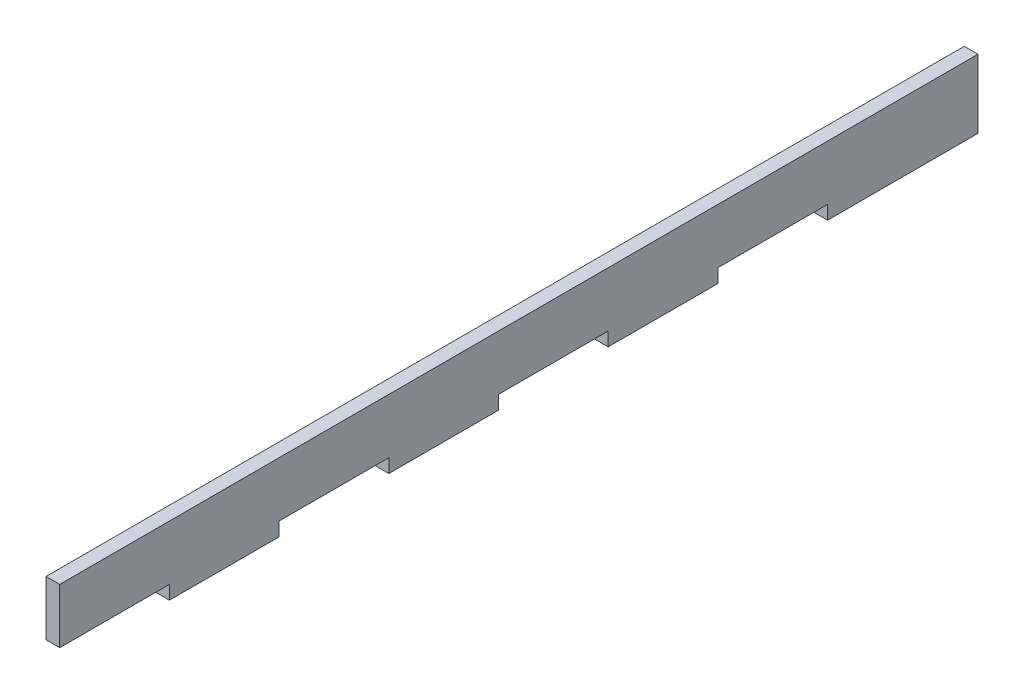
ISO-10303-21;
HEADER;
FILE_DESCRIPTION(('STEP AP214'),'2;1');
FILE_NAME('part.step','',(''),(''),'','','');
FILE_SCHEMA(('AUTOMOTIVE_DESIGN { 1 0 10303 214 1 1 1 1 }'));
ENDSEC;
DATA;
#1=APPLICATION_CONTEXT('core data for automotive mechanical design processes');
#2=APPLICATION_PROTOCOL_DEFINITION('international standard','automotive_design',2000,#1);
#3=PRODUCT_CONTEXT('',#1,'mechanical');
#4=PRODUCT('Part','Part','',(#3));
#5=PRODUCT_RELATED_PRODUCT_CATEGORY('part','',(#4));
#6=PRODUCT_DEFINITION_FORMATION('','',#4);
#7=PRODUCT_DEFINITION_CONTEXT('part definition',#1,'design');
#8=PRODUCT_DEFINITION('design','',#6,#7);
#9=PRODUCT_DEFINITION_SHAPE('','',#8);
#10=(LENGTH_UNIT() NAMED_UNIT(*) SI_UNIT(.MILLI.,.METRE.));
#11=(NAMED_UNIT(*) PLANE_ANGLE_UNIT() SI_UNIT($,.RADIAN.));
#12=(NAMED_UNIT(*) SI_UNIT($,.STERADIAN.) SOLID_ANGLE_UNIT());
#13=UNCERTAINTY_MEASURE_WITH_UNIT(LENGTH_MEASURE(1.E-05),#10,'distance_accuracy_value','');
#14=(GEOMETRIC_REPRESENTATION_CONTEXT(3) GLOBAL_UNCERTAINTY_ASSIGNED_CONTEXT((#13)) GLOBAL_UNIT_ASSIGNED_CONTEXT((#10,
#11,#12)) REPRESENTATION_CONTEXT('',''));
#15=CARTESIAN_POINT('',(0.,0.,0.));
#16=DIRECTION('',(0.,0.,1.));
#17=DIRECTION('',(1.,0.,0.));
#18=AXIS2_PLACEMENT_3D('',#15,#16,#17);
#19=CARTESIAN_POINT('',(6.35,0.,-422.789544579189));
#20=DIRECTION('',(0.,0.,1.));
#21=DIRECTION('',(1.,0.,0.));
#22=AXIS2_PLACEMENT_3D('',#19,#20,#21);
#23=PLANE('',#22);
#24=DIRECTION('',(0.,1.,0.));
#25=VECTOR('',#24,1.);
#26=CARTESIAN_POINT('',(0.,0.,-422.789544579189));
#27=LINE('',#26,#25);
#28=CARTESIAN_POINT('',(0.,0.,-422.789544579189));
#29=VERTEX_POINT('',#28);
#30=CARTESIAN_POINT('',(0.,31.7499999999996,-422.789544579189));
#31=VERTEX_POINT('',#30);
#32=EDGE_CURVE('E191',#29,#31,#27,.T.);
#33=ORIENTED_EDGE('',*,*,#32,.T.);
#34=DIRECTION('',(-1.,0.,0.));
#35=VECTOR('',#34,1.);
#36=CARTESIAN_POINT('',(6.35,31.7499999999996,-422.789544579189));
#37=LINE('',#36,#35);
#38=CARTESIAN_POINT('',(6.35,31.7499999999996,-422.789544579189));
#39=VERTEX_POINT('',#38);
#40=EDGE_CURVE('E11',#39,#31,#37,.T.);
#41=ORIENTED_EDGE('',*,*,#40,.F.);
#42=DIRECTION('',(0.,1.,0.));
#43=VECTOR('',#42,1.);
#44=CARTESIAN_POINT('',(6.35,0.,-422.789544579189));
#45=LINE('',#44,#43);
#46=CARTESIAN_POINT('',(6.35,0.,-422.789544579189));
#47=VERTEX_POINT('',#46);
#48=EDGE_CURVE('E225',#47,#39,#45,.T.);
#49=ORIENTED_EDGE('',*,*,#48,.F.);
#50=DIRECTION('',(-1.,0.,0.));
#51=VECTOR('',#50,1.);
#52=CARTESIAN_POINT('',(6.35,0.,-422.789544579189));
#53=LINE('',#52,#51);
#54=EDGE_CURVE('E187',#47,#29,#53,.T.);
#55=ORIENTED_EDGE('',*,*,#54,.T.);
#56=EDGE_LOOP('',(#33,#41,#49,#55));
#57=FACE_BOUND('',#56,.T.);
#58=ADVANCED_FACE('F35',(#57),#23,.F.);
#59=CARTESIAN_POINT('',(6.35,31.7499999999996,2.48059425587843));
#60=DIRECTION('',(0.,-1.,0.));
#61=DIRECTION('',(0.,0.,-1.));
#62=AXIS2_PLACEMENT_3D('',#59,#60,#61);
#63=PLANE('',#62);
#64=DIRECTION('',(0.,0.,1.));
#65=VECTOR('',#64,1.);
#66=CARTESIAN_POINT('',(0.,31.7499999999996,2.48059425587843));
#67=LINE('',#66,#65);
#68=CARTESIAN_POINT('',(0.,31.7499999999996,2.48059425587843));
#69=VERTEX_POINT('',#68);
#70=EDGE_CURVE('E194',#31,#69,#67,.T.);
#71=ORIENTED_EDGE('',*,*,#70,.T.);
#72=DIRECTION('',(-1.,0.,0.));
#73=VECTOR('',#72,1.);
#74=CARTESIAN_POINT('',(6.35,31.7499999999996,2.48059425587843));
#75=LINE('',#74,#73);
#76=CARTESIAN_POINT('',(6.35,31.7499999999996,2.48059425587843));
#77=VERTEX_POINT('',#76);
#78=EDGE_CURVE('E43',#77,#69,#75,.T.);
#79=ORIENTED_EDGE('',*,*,#78,.F.);
#80=DIRECTION('',(0.,0.,1.));
#81=VECTOR('',#80,1.);
#82=CARTESIAN_POINT('',(6.35,31.7499999999996,2.48059425587843));
#83=LINE('',#82,#81);
#84=EDGE_CURVE('E124',#39,#77,#83,.T.);
#85=ORIENTED_EDGE('',*,*,#84,.F.);
#86=ORIENTED_EDGE('',*,*,#40,.T.);
#87=EDGE_LOOP('',(#71,#79,#85,#86));
#88=FACE_BOUND('',#87,.T.);
#89=ADVANCED_FACE('F333',(#88),#63,.F.);
#90=CARTESIAN_POINT('',(6.35,6.34999999999997,2.48059425587843));
#91=DIRECTION('',(0.,0.,-1.));
#92=DIRECTION('',(-1.,0.,0.));
#93=AXIS2_PLACEMENT_3D('',#90,#91,#92);
#94=PLANE('',#93);
#95=DIRECTION('',(0.,-1.,0.));
#96=VECTOR('',#95,1.);
#97=CARTESIAN_POINT('',(0.,6.34999999999997,2.48059425587843));
#98=LINE('',#97,#96);
#99=CARTESIAN_POINT('',(0.,6.34999999999997,2.48059425587843));
#100=VERTEX_POINT('',#99);
#101=EDGE_CURVE('E196',#69,#100,#98,.T.);
#102=ORIENTED_EDGE('',*,*,#101,.T.);
#103=DIRECTION('',(-1.,0.,0.));
#104=VECTOR('',#103,1.);
#105=CARTESIAN_POINT('',(6.35,6.34999999999997,2.48059425587843));
#106=LINE('',#105,#104);
#107=CARTESIAN_POINT('',(6.35,6.34999999999997,2.48059425587843));
#108=VERTEX_POINT('',#107);
#109=EDGE_CURVE('E262',#108,#100,#106,.T.);
#110=ORIENTED_EDGE('',*,*,#109,.F.);
#111=DIRECTION('',(0.,-1.,0.));
#112=VECTOR('',#111,1.);
#113=CARTESIAN_POINT('',(6.35,6.34999999999997,2.48059425587843));
#114=LINE('',#113,#112);
#115=EDGE_CURVE('E270',#77,#108,#114,.T.);
#116=ORIENTED_EDGE('',*,*,#115,.F.);
#117=ORIENTED_EDGE('',*,*,#78,.T.);
#118=EDGE_LOOP('',(#102,#110,#116,#117));
#119=FACE_BOUND('',#118,.T.);
#120=ADVANCED_FACE('F268',(#119),#94,.F.);
#121=CARTESIAN_POINT('',(6.35,6.34999999999997,2.48059425587843));
#122=DIRECTION('',(0.,1.,0.));
#123=DIRECTION('',(0.,0.,1.));
#124=AXIS2_PLACEMENT_3D('',#121,#122,#123);
#125=PLANE('',#124);
#126=DIRECTION('',(0.,0.,-1.));
#127=VECTOR('',#126,1.);
#128=CARTESIAN_POINT('',(0.,6.34999999999997,2.48059425587843));
#129=LINE('',#128,#127);
#130=CARTESIAN_POINT('',(0.,6.34999999999999,-48.3194057441216));
#131=VERTEX_POINT('',#130);
#132=EDGE_CURVE('E198',#100,#131,#129,.T.);
#133=ORIENTED_EDGE('',*,*,#132,.T.);
#134=DIRECTION('',(-1.,0.,0.));
#135=VECTOR('',#134,1.);
#136=CARTESIAN_POINT('',(6.35,6.34999999999999,-48.3194057441216));
#137=LINE('',#136,#135);
#138=CARTESIAN_POINT('',(6.35,6.34999999999999,-48.3194057441216));
#139=VERTEX_POINT('',#138);
#140=EDGE_CURVE('E259',#139,#131,#137,.T.);
#141=ORIENTED_EDGE('',*,*,#140,.F.);
#142=DIRECTION('',(0.,0.,-1.));
#143=VECTOR('',#142,1.);
#144=CARTESIAN_POINT('',(6.35,6.34999999999997,2.48059425587843));
#145=LINE('',#144,#143);
#146=EDGE_CURVE('E288',#108,#139,#145,.T.);
#147=ORIENTED_EDGE('',*,*,#146,.F.);
#148=ORIENTED_EDGE('',*,*,#109,.T.);
#149=EDGE_LOOP('',(#133,#141,#147,#148));
#150=FACE_BOUND('',#149,.T.);
#151=ADVANCED_FACE('F279',(#150),#125,.F.);
#152=CARTESIAN_POINT('',(6.35,6.34999999999999,-48.3194057441216));
#153=DIRECTION('',(0.,0.,-1.));
#154=DIRECTION('',(-1.,0.,0.));
#155=AXIS2_PLACEMENT_3D('',#152,#153,#154);
#156=PLANE('',#155);
#157=DIRECTION('',(0.,-1.,0.));
#158=VECTOR('',#157,1.);
#159=CARTESIAN_POINT('',(0.,6.34999999999999,-48.3194057441216));
#160=LINE('',#159,#158);
#161=CARTESIAN_POINT('',(0.,0.,-48.3194057441216));
#162=VERTEX_POINT('',#161);
#163=EDGE_CURVE('E200',#131,#162,#160,.T.);
#164=ORIENTED_EDGE('',*,*,#163,.T.);
#165=DIRECTION('',(-1.,0.,0.));
#166=VECTOR('',#165,1.);
#167=CARTESIAN_POINT('',(6.35,0.,-48.3194057441216));
#168=LINE('',#167,#166);
#169=CARTESIAN_POINT('',(6.35,0.,-48.3194057441216));
#170=VERTEX_POINT('',#169);
#171=EDGE_CURVE('E256',#170,#162,#168,.T.);
#172=ORIENTED_EDGE('',*,*,#171,.F.);
#173=DIRECTION('',(0.,-1.,0.));
#174=VECTOR('',#173,1.);
#175=CARTESIAN_POINT('',(6.35,6.34999999999999,-48.3194057441216));
#176=LINE('',#175,#174);
#177=EDGE_CURVE('E285',#139,#170,#176,.T.);
#178=ORIENTED_EDGE('',*,*,#177,.F.);
#179=ORIENTED_EDGE('',*,*,#140,.T.);
#180=EDGE_LOOP('',(#164,#172,#178,#179));
#181=FACE_BOUND('',#180,.T.);
#182=ADVANCED_FACE('F283',(#181),#156,.F.);
#183=CARTESIAN_POINT('',(6.35,0.,-48.3194057441216));
#184=DIRECTION('',(0.,1.,0.));
#185=DIRECTION('',(0.,0.,1.));
#186=AXIS2_PLACEMENT_3D('',#183,#184,#185);
#187=PLANE('',#186);
#188=DIRECTION('',(0.,0.,-1.));
#189=VECTOR('',#188,1.);
#190=CARTESIAN_POINT('',(0.,0.,-48.3194057441216));
#191=LINE('',#190,#189);
#192=CARTESIAN_POINT('',(0.,0.,-99.1194057441216));
#193=VERTEX_POINT('',#192);
#194=EDGE_CURVE('E202',#162,#193,#191,.T.);
#195=ORIENTED_EDGE('',*,*,#194,.T.);
#196=DIRECTION('',(-1.,0.,0.));
#197=VECTOR('',#196,1.);
#198=CARTESIAN_POINT('',(6.35,0.,-99.1194057441216));
#199=LINE('',#198,#197);
#200=CARTESIAN_POINT('',(6.35,0.,-99.1194057441216));
#201=VERTEX_POINT('',#200);
#202=EDGE_CURVE('E253',#201,#193,#199,.T.);
#203=ORIENTED_EDGE('',*,*,#202,.F.);
#204=DIRECTION('',(0.,0.,-1.));
#205=VECTOR('',#204,1.);
#206=CARTESIAN_POINT('',(6.35,0.,-48.3194057441216));
#207=LINE('',#206,#205);
#208=EDGE_CURVE('E287',#170,#201,#207,.T.);
#209=ORIENTED_EDGE('',*,*,#208,.F.);
#210=ORIENTED_EDGE('',*,*,#171,.T.);
#211=EDGE_LOOP('',(#195,#203,#209,#210));
#212=FACE_BOUND('',#211,.T.);
#213=ADVANCED_FACE('F346',(#212),#187,.F.);
#214=CARTESIAN_POINT('',(6.35,6.34999999999997,-99.1194057441216));
#215=DIRECTION('',(0.,0.,1.));
#216=DIRECTION('',(1.,0.,0.));
#217=AXIS2_PLACEMENT_3D('',#214,#215,#216);
#218=PLANE('',#217);
#219=DIRECTION('',(0.,1.,0.));
#220=VECTOR('',#219,1.);
#221=CARTESIAN_POINT('',(0.,6.34999999999997,-99.1194057441216));
#222=LINE('',#221,#220);
#223=CARTESIAN_POINT('',(0.,6.34999999999997,-99.1194057441216));
#224=VERTEX_POINT('',#223);
#225=EDGE_CURVE('E204',#193,#224,#222,.T.);
#226=ORIENTED_EDGE('',*,*,#225,.T.);
#227=DIRECTION('',(-1.,0.,0.));
#228=VECTOR('',#227,1.);
#229=CARTESIAN_POINT('',(6.35,6.34999999999997,-99.1194057441216));
#230=LINE('',#229,#228);
#231=CARTESIAN_POINT('',(6.35,6.34999999999997,-99.1194057441216));
#232=VERTEX_POINT('',#231);
#233=EDGE_CURVE('E250',#232,#224,#230,.T.);
#234=ORIENTED_EDGE('',*,*,#233,.F.);
#235=DIRECTION('',(0.,1.,0.));
#236=VECTOR('',#235,1.);
#237=CARTESIAN_POINT('',(6.35,6.34999999999997,-99.1194057441216));
#238=LINE('',#237,#236);
#239=EDGE_CURVE('E290',#201,#232,#238,.T.);
#240=ORIENTED_EDGE('',*,*,#239,.F.);
#241=ORIENTED_EDGE('',*,*,#202,.T.);
#242=EDGE_LOOP('',(#226,#234,#240,#241));
#243=FACE_BOUND('',#242,.T.);
#244=ADVANCED_FACE('F349',(#243),#218,.F.);
#245=CARTESIAN_POINT('',(6.35,6.34999999999997,-99.1194057441216));
#246=DIRECTION('',(0.,1.,0.));
#247=DIRECTION('',(0.,0.,1.));
#248=AXIS2_PLACEMENT_3D('',#245,#246,#247);
#249=PLANE('',#248);
#250=DIRECTION('',(0.,0.,-1.));
#251=VECTOR('',#250,1.);
#252=CARTESIAN_POINT('',(0.,6.34999999999997,-99.1194057441216));
#253=LINE('',#252,#251);
#254=CARTESIAN_POINT('',(0.,6.34999999999997,-149.919405744122));
#255=VERTEX_POINT('',#254);
#256=EDGE_CURVE('E206',#224,#255,#253,.T.);
#257=ORIENTED_EDGE('',*,*,#256,.T.);
#258=DIRECTION('',(-1.,0.,0.));
#259=VECTOR('',#258,1.);
#260=CARTESIAN_POINT('',(6.35,6.34999999999997,-149.919405744122));
#261=LINE('',#260,#259);
#262=CARTESIAN_POINT('',(6.35,6.34999999999997,-149.919405744122));
#263=VERTEX_POINT('',#262);
#264=EDGE_CURVE('E247',#263,#255,#261,.T.);
#265=ORIENTED_EDGE('',*,*,#264,.F.);
#266=DIRECTION('',(0.,0.,-1.));
#267=VECTOR('',#266,1.);
#268=CARTESIAN_POINT('',(6.35,6.34999999999997,-99.1194057441216));
#269=LINE('',#268,#267);
#270=EDGE_CURVE('E296',#232,#263,#269,.T.);
#271=ORIENTED_EDGE('',*,*,#270,.F.);
#272=ORIENTED_EDGE('',*,*,#233,.T.);
#273=EDGE_LOOP('',(#257,#265,#271,#272));
#274=FACE_BOUND('',#273,.T.);
#275=ADVANCED_FACE('F353',(#274),#249,.F.);
#276=CARTESIAN_POINT('',(6.35,6.34999999999997,-149.919405744122));
#277=DIRECTION('',(0.,0.,-1.));
#278=DIRECTION('',(-1.,0.,0.));
#279=AXIS2_PLACEMENT_3D('',#276,#277,#278);
#280=PLANE('',#279);
#281=DIRECTION('',(0.,-1.,0.));
#282=VECTOR('',#281,1.);
#283=CARTESIAN_POINT('',(0.,6.34999999999997,-149.919405744122));
#284=LINE('',#283,#282);
#285=CARTESIAN_POINT('',(0.,0.,-149.919405744122));
#286=VERTEX_POINT('',#285);
#287=EDGE_CURVE('E208',#255,#286,#284,.T.);
#288=ORIENTED_EDGE('',*,*,#287,.T.);
#289=DIRECTION('',(-1.,0.,0.));
#290=VECTOR('',#289,1.);
#291=CARTESIAN_POINT('',(6.35,0.,-149.919405744122));
#292=LINE('',#291,#290);
#293=CARTESIAN_POINT('',(6.35,0.,-149.919405744122));
#294=VERTEX_POINT('',#293);
#295=EDGE_CURVE('E244',#294,#286,#292,.T.);
#296=ORIENTED_EDGE('',*,*,#295,.F.);
#297=DIRECTION('',(0.,-1.,0.));
#298=VECTOR('',#297,1.);
#299=CARTESIAN_POINT('',(6.35,6.34999999999997,-149.919405744122));
#300=LINE('',#299,#298);
#301=EDGE_CURVE('E298',#263,#294,#300,.T.);
#302=ORIENTED_EDGE('',*,*,#301,.F.);
#303=ORIENTED_EDGE('',*,*,#264,.T.);
#304=EDGE_LOOP('',(#288,#296,#302,#303));
#305=FACE_BOUND('',#304,.T.);
#306=ADVANCED_FACE('F357',(#305),#280,.F.);
#307=CARTESIAN_POINT('',(6.35,0.,-149.919405744122));
#308=DIRECTION('',(0.,1.,0.));
#309=DIRECTION('',(0.,0.,1.));
#310=AXIS2_PLACEMENT_3D('',#307,#308,#309);
#311=PLANE('',#310);
#312=DIRECTION('',(0.,0.,-1.));
#313=VECTOR('',#312,1.);
#314=CARTESIAN_POINT('',(0.,0.,-149.919405744122));
#315=LINE('',#314,#313);
#316=CARTESIAN_POINT('',(0.,0.,-200.719405744122));
#317=VERTEX_POINT('',#316);
#318=EDGE_CURVE('E210',#286,#317,#315,.T.);
#319=ORIENTED_EDGE('',*,*,#318,.T.);
#320=DIRECTION('',(-1.,0.,0.));
#321=VECTOR('',#320,1.);
#322=CARTESIAN_POINT('',(6.35,0.,-200.719405744122));
#323=LINE('',#322,#321);
#324=CARTESIAN_POINT('',(6.35,0.,-200.719405744122));
#325=VERTEX_POINT('',#324);
#326=EDGE_CURVE('E241',#325,#317,#323,.T.);
#327=ORIENTED_EDGE('',*,*,#326,.F.);
#328=DIRECTION('',(0.,0.,-1.));
#329=VECTOR('',#328,1.);
#330=CARTESIAN_POINT('',(6.35,0.,-149.919405744122));
#331=LINE('',#330,#329);
#332=EDGE_CURVE('E300',#294,#325,#331,.T.);
#333=ORIENTED_EDGE('',*,*,#332,.F.);
#334=ORIENTED_EDGE('',*,*,#295,.T.);
#335=EDGE_LOOP('',(#319,#327,#333,#334));
#336=FACE_BOUND('',#335,.T.);
#337=ADVANCED_FACE('F361',(#336),#311,.F.);
#338=CARTESIAN_POINT('',(6.35,6.34999999999997,-200.719405744122));
#339=DIRECTION('',(0.,0.,1.));
#340=DIRECTION('',(1.,0.,0.));
#341=AXIS2_PLACEMENT_3D('',#338,#339,#340);
#342=PLANE('',#341);
#343=DIRECTION('',(0.,1.,0.));
#344=VECTOR('',#343,1.);
#345=CARTESIAN_POINT('',(0.,6.34999999999997,-200.719405744122));
#346=LINE('',#345,#344);
#347=CARTESIAN_POINT('',(0.,6.34999999999997,-200.719405744122));
#348=VERTEX_POINT('',#347);
#349=EDGE_CURVE('E212',#317,#348,#346,.T.);
#350=ORIENTED_EDGE('',*,*,#349,.T.);
#351=DIRECTION('',(-1.,0.,0.));
#352=VECTOR('',#351,1.);
#353=CARTESIAN_POINT('',(6.35,6.34999999999997,-200.719405744122));
#354=LINE('',#353,#352);
#355=CARTESIAN_POINT('',(6.35,6.34999999999997,-200.719405744122));
#356=VERTEX_POINT('',#355);
#357=EDGE_CURVE('E238',#356,#348,#354,.T.);
#358=ORIENTED_EDGE('',*,*,#357,.F.);
#359=DIRECTION('',(0.,1.,0.));
#360=VECTOR('',#359,1.);
#361=CARTESIAN_POINT('',(6.35,6.34999999999997,-200.719405744122));
#362=LINE('',#361,#360);
#363=EDGE_CURVE('E302',#325,#356,#362,.T.);
#364=ORIENTED_EDGE('',*,*,#363,.F.);
#365=ORIENTED_EDGE('',*,*,#326,.T.);
#366=EDGE_LOOP('',(#350,#358,#364,#365));
#367=FACE_BOUND('',#366,.T.);
#368=ADVANCED_FACE('F365',(#367),#342,.F.);
#369=CARTESIAN_POINT('',(6.35,6.34999999999997,-200.719405744122));
#370=DIRECTION('',(0.,1.,0.));
#371=DIRECTION('',(0.,0.,1.));
#372=AXIS2_PLACEMENT_3D('',#369,#370,#371);
#373=PLANE('',#372);
#374=DIRECTION('',(0.,0.,-1.));
#375=VECTOR('',#374,1.);
#376=CARTESIAN_POINT('',(0.,6.34999999999997,-200.719405744122));
#377=LINE('',#376,#375);
#378=CARTESIAN_POINT('',(0.,6.34999999999997,-251.519405744122));
#379=VERTEX_POINT('',#378);
#380=EDGE_CURVE('E214',#348,#379,#377,.T.);
#381=ORIENTED_EDGE('',*,*,#380,.T.);
#382=DIRECTION('',(-1.,0.,0.));
#383=VECTOR('',#382,1.);
#384=CARTESIAN_POINT('',(6.35,6.34999999999997,-251.519405744122));
#385=LINE('',#384,#383);
#386=CARTESIAN_POINT('',(6.35,6.34999999999997,-251.519405744122));
#387=VERTEX_POINT('',#386);
#388=EDGE_CURVE('E235',#387,#379,#385,.T.);
#389=ORIENTED_EDGE('',*,*,#388,.F.);
#390=DIRECTION('',(0.,0.,-1.));
#391=VECTOR('',#390,1.);
#392=CARTESIAN_POINT('',(6.35,6.34999999999997,-200.719405744122));
#393=LINE('',#392,#391);
#394=EDGE_CURVE('E304',#356,#387,#393,.T.);
#395=ORIENTED_EDGE('',*,*,#394,.F.);
#396=ORIENTED_EDGE('',*,*,#357,.T.);
#397=EDGE_LOOP('',(#381,#389,#395,#396));
#398=FACE_BOUND('',#397,.T.);
#399=ADVANCED_FACE('F369',(#398),#373,.F.);
#400=CARTESIAN_POINT('',(6.35,6.34999999999997,-251.519405744122));
#401=DIRECTION('',(0.,0.,-1.));
#402=DIRECTION('',(-1.,0.,0.));
#403=AXIS2_PLACEMENT_3D('',#400,#401,#402);
#404=PLANE('',#403);
#405=DIRECTION('',(0.,-1.,0.));
#406=VECTOR('',#405,1.);
#407=CARTESIAN_POINT('',(0.,6.34999999999997,-251.519405744122));
#408=LINE('',#407,#406);
#409=CARTESIAN_POINT('',(0.,0.,-251.519405744122));
#410=VERTEX_POINT('',#409);
#411=EDGE_CURVE('E216',#379,#410,#408,.T.);
#412=ORIENTED_EDGE('',*,*,#411,.T.);
#413=DIRECTION('',(-1.,0.,0.));
#414=VECTOR('',#413,1.);
#415=CARTESIAN_POINT('',(6.35,0.,-251.519405744122));
#416=LINE('',#415,#414);
#417=CARTESIAN_POINT('',(6.35,0.,-251.519405744122));
#418=VERTEX_POINT('',#417);
#419=EDGE_CURVE('E232',#418,#410,#416,.T.);
#420=ORIENTED_EDGE('',*,*,#419,.F.);
#421=DIRECTION('',(0.,-1.,0.));
#422=VECTOR('',#421,1.);
#423=CARTESIAN_POINT('',(6.35,6.34999999999997,-251.519405744122));
#424=LINE('',#423,#422);
#425=EDGE_CURVE('E306',#387,#418,#424,.T.);
#426=ORIENTED_EDGE('',*,*,#425,.F.);
#427=ORIENTED_EDGE('',*,*,#388,.T.);
#428=EDGE_LOOP('',(#412,#420,#426,#427));
#429=FACE_BOUND('',#428,.T.);
#430=ADVANCED_FACE('F373',(#429),#404,.F.);
#431=CARTESIAN_POINT('',(6.35,0.,-251.519405744122));
#432=DIRECTION('',(0.,1.,0.));
#433=DIRECTION('',(0.,0.,1.));
#434=AXIS2_PLACEMENT_3D('',#431,#432,#433);
#435=PLANE('',#434);
#436=DIRECTION('',(0.,0.,-1.));
#437=VECTOR('',#436,1.);
#438=CARTESIAN_POINT('',(0.,0.,-251.519405744122));
#439=LINE('',#438,#437);
#440=CARTESIAN_POINT('',(0.,0.,-302.319405744122));
#441=VERTEX_POINT('',#440);
#442=EDGE_CURVE('E218',#410,#441,#439,.T.);
#443=ORIENTED_EDGE('',*,*,#442,.T.);
#444=DIRECTION('',(-1.,0.,0.));
#445=VECTOR('',#444,1.);
#446=CARTESIAN_POINT('',(6.35,0.,-302.319405744122));
#447=LINE('',#446,#445);
#448=CARTESIAN_POINT('',(6.35,0.,-302.319405744122));
#449=VERTEX_POINT('',#448);
#450=EDGE_CURVE('E229',#449,#441,#447,.T.);
#451=ORIENTED_EDGE('',*,*,#450,.F.);
#452=DIRECTION('',(0.,0.,-1.));
#453=VECTOR('',#452,1.);
#454=CARTESIAN_POINT('',(6.35,0.,-251.519405744122));
#455=LINE('',#454,#453);
#456=EDGE_CURVE('E308',#418,#449,#455,.T.);
#457=ORIENTED_EDGE('',*,*,#456,.F.);
#458=ORIENTED_EDGE('',*,*,#419,.T.);
#459=EDGE_LOOP('',(#443,#451,#457,#458));
#460=FACE_BOUND('',#459,.T.);
#461=ADVANCED_FACE('F314',(#460),#435,.F.);
#462=CARTESIAN_POINT('',(6.35,6.34999999999997,-302.319405744122));
#463=DIRECTION('',(0.,0.,1.));
#464=DIRECTION('',(1.,0.,0.));
#465=AXIS2_PLACEMENT_3D('',#462,#463,#464);
#466=PLANE('',#465);
#467=DIRECTION('',(0.,1.,0.));
#468=VECTOR('',#467,1.);
#469=CARTESIAN_POINT('',(0.,6.34999999999997,-302.319405744122));
#470=LINE('',#469,#468);
#471=CARTESIAN_POINT('',(0.,6.34999999999997,-302.319405744122));
#472=VERTEX_POINT('',#471);
#473=EDGE_CURVE('E220',#441,#472,#470,.T.);
#474=ORIENTED_EDGE('',*,*,#473,.T.);
#475=DIRECTION('',(-1.,0.,0.));
#476=VECTOR('',#475,1.);
#477=CARTESIAN_POINT('',(6.35,6.34999999999997,-302.319405744122));
#478=LINE('',#477,#476);
#479=CARTESIAN_POINT('',(6.35,6.34999999999997,-302.319405744122));
#480=VERTEX_POINT('',#479);
#481=EDGE_CURVE('E182',#480,#472,#478,.T.);
#482=ORIENTED_EDGE('',*,*,#481,.F.);
#483=DIRECTION('',(0.,1.,0.));
#484=VECTOR('',#483,1.);
#485=CARTESIAN_POINT('',(6.35,6.34999999999997,-302.319405744122));
#486=LINE('',#485,#484);
#487=EDGE_CURVE('E173',#449,#480,#486,.T.);
#488=ORIENTED_EDGE('',*,*,#487,.F.);
#489=ORIENTED_EDGE('',*,*,#450,.T.);
#490=EDGE_LOOP('',(#474,#482,#488,#489));
#491=FACE_BOUND('',#490,.T.);
#492=ADVANCED_FACE('F318',(#491),#466,.F.);
#493=CARTESIAN_POINT('',(6.35,6.34999999999997,-302.319405744122));
#494=DIRECTION('',(0.,1.,0.));
#495=DIRECTION('',(0.,0.,1.));
#496=AXIS2_PLACEMENT_3D('',#493,#494,#495);
#497=PLANE('',#496);
#498=DIRECTION('',(0.,0.,-1.));
#499=VECTOR('',#498,1.);
#500=CARTESIAN_POINT('',(0.,6.34999999999997,-302.319405744122));
#501=LINE('',#500,#499);
#502=CARTESIAN_POINT('',(0.,6.34999999999997,-353.119405744122));
#503=VERTEX_POINT('',#502);
#504=EDGE_CURVE('E181',#472,#503,#501,.T.);
#505=ORIENTED_EDGE('',*,*,#504,.T.);
#506=DIRECTION('',(-1.,0.,0.));
#507=VECTOR('',#506,1.);
#508=CARTESIAN_POINT('',(6.35,6.34999999999997,-353.119405744122));
#509=LINE('',#508,#507);
#510=CARTESIAN_POINT('',(6.35,6.34999999999997,-353.119405744122));
#511=VERTEX_POINT('',#510);
#512=EDGE_CURVE('E178',#511,#503,#509,.T.);
#513=ORIENTED_EDGE('',*,*,#512,.F.);
#514=DIRECTION('',(0.,0.,-1.));
#515=VECTOR('',#514,1.);
#516=CARTESIAN_POINT('',(6.35,6.34999999999997,-302.319405744122));
#517=LINE('',#516,#515);
#518=EDGE_CURVE('E167',#480,#511,#517,.T.);
#519=ORIENTED_EDGE('',*,*,#518,.F.);
#520=ORIENTED_EDGE('',*,*,#481,.T.);
#521=EDGE_LOOP('',(#505,#513,#519,#520));
#522=FACE_BOUND('',#521,.T.);
#523=ADVANCED_FACE('F179',(#522),#497,.F.);
#524=CARTESIAN_POINT('',(6.35,6.34999999999997,-353.119405744122));
#525=DIRECTION('',(0.,0.,-1.));
#526=DIRECTION('',(-1.,0.,0.));
#527=AXIS2_PLACEMENT_3D('',#524,#525,#526);
#528=PLANE('',#527);
#529=DIRECTION('',(0.,-1.,0.));
#530=VECTOR('',#529,1.);
#531=CARTESIAN_POINT('',(0.,6.34999999999997,-353.119405744122));
#532=LINE('',#531,#530);
#533=CARTESIAN_POINT('',(0.,0.,-353.119405744122));
#534=VERTEX_POINT('',#533);
#535=EDGE_CURVE('E110',#503,#534,#532,.T.);
#536=ORIENTED_EDGE('',*,*,#535,.T.);
#537=DIRECTION('',(-1.,0.,0.));
#538=VECTOR('',#537,1.);
#539=CARTESIAN_POINT('',(6.35,0.,-353.119405744122));
#540=LINE('',#539,#538);
#541=CARTESIAN_POINT('',(6.35,0.,-353.119405744122));
#542=VERTEX_POINT('',#541);
#543=EDGE_CURVE('E183',#542,#534,#540,.T.);
#544=ORIENTED_EDGE('',*,*,#543,.F.);
#545=DIRECTION('',(0.,-1.,0.));
#546=VECTOR('',#545,1.);
#547=CARTESIAN_POINT('',(6.35,6.34999999999997,-353.119405744122));
#548=LINE('',#547,#546);
#549=EDGE_CURVE('E171',#511,#542,#548,.T.);
#550=ORIENTED_EDGE('',*,*,#549,.F.);
#551=ORIENTED_EDGE('',*,*,#512,.T.);
#552=EDGE_LOOP('',(#536,#544,#550,#551));
#553=FACE_BOUND('',#552,.T.);
#554=ADVANCED_FACE('F185',(#553),#528,.F.);
#555=CARTESIAN_POINT('',(6.35,0.,-353.119405744122));
#556=DIRECTION('',(0.,1.,0.));
#557=DIRECTION('',(0.,0.,1.));
#558=AXIS2_PLACEMENT_3D('',#555,#556,#557);
#559=PLANE('',#558);
#560=DIRECTION('',(0.,0.,-1.));
#561=VECTOR('',#560,1.);
#562=CARTESIAN_POINT('',(0.,0.,-353.119405744122));
#563=LINE('',#562,#561);
#564=EDGE_CURVE('E116',#534,#29,#563,.T.);
#565=ORIENTED_EDGE('',*,*,#564,.T.);
#566=ORIENTED_EDGE('',*,*,#54,.F.);
#567=DIRECTION('',(0.,0.,-1.));
#568=VECTOR('',#567,1.);
#569=CARTESIAN_POINT('',(6.35,0.,-353.119405744122));
#570=LINE('',#569,#568);
#571=EDGE_CURVE('E51',#542,#47,#570,.T.);
#572=ORIENTED_EDGE('',*,*,#571,.F.);
#573=ORIENTED_EDGE('',*,*,#543,.T.);
#574=EDGE_LOOP('',(#565,#566,#572,#573));
#575=FACE_BOUND('',#574,.T.);
#576=ADVANCED_FACE('F322',(#575),#559,.F.);
#577=CARTESIAN_POINT('',(6.35,0.,0.));
#578=DIRECTION('',(-1.,0.,0.));
#579=DIRECTION('',(0.,0.,1.));
#580=AXIS2_PLACEMENT_3D('',#577,#578,#579);
#581=PLANE('',#580);
#582=ORIENTED_EDGE('',*,*,#48,.T.);
#583=ORIENTED_EDGE('',*,*,#84,.T.);
#584=ORIENTED_EDGE('',*,*,#115,.T.);
#585=ORIENTED_EDGE('',*,*,#146,.T.);
#586=ORIENTED_EDGE('',*,*,#177,.T.);
#587=ORIENTED_EDGE('',*,*,#208,.T.);
#588=ORIENTED_EDGE('',*,*,#239,.T.);
#589=ORIENTED_EDGE('',*,*,#270,.T.);
#590=ORIENTED_EDGE('',*,*,#301,.T.);
#591=ORIENTED_EDGE('',*,*,#332,.T.);
#592=ORIENTED_EDGE('',*,*,#363,.T.);
#593=ORIENTED_EDGE('',*,*,#394,.T.);
#594=ORIENTED_EDGE('',*,*,#425,.T.);
#595=ORIENTED_EDGE('',*,*,#456,.T.);
#596=ORIENTED_EDGE('',*,*,#487,.T.);
#597=ORIENTED_EDGE('',*,*,#518,.T.);
#598=ORIENTED_EDGE('',*,*,#549,.T.);
#599=ORIENTED_EDGE('',*,*,#571,.T.);
#600=EDGE_LOOP('',(#582,#583,#584,#585,#586,#587,#588,#589,#590,#591,#592,#593,#594,#595,#596,
#597,#598,#599));
#601=FACE_BOUND('',#600,.T.);
#602=ADVANCED_FACE('F169',(#601),#581,.F.);
#603=CARTESIAN_POINT('',(0.,0.,0.));
#604=DIRECTION('',(-1.,0.,0.));
#605=DIRECTION('',(0.,0.,1.));
#606=AXIS2_PLACEMENT_3D('',#603,#604,#605);
#607=PLANE('',#606);
#608=ORIENTED_EDGE('',*,*,#32,.F.);
#609=ORIENTED_EDGE('',*,*,#564,.F.);
#610=ORIENTED_EDGE('',*,*,#535,.F.);
#611=ORIENTED_EDGE('',*,*,#504,.F.);
#612=ORIENTED_EDGE('',*,*,#473,.F.);
#613=ORIENTED_EDGE('',*,*,#442,.F.);
#614=ORIENTED_EDGE('',*,*,#411,.F.);
#615=ORIENTED_EDGE('',*,*,#380,.F.);
#616=ORIENTED_EDGE('',*,*,#349,.F.);
#617=ORIENTED_EDGE('',*,*,#318,.F.);
#618=ORIENTED_EDGE('',*,*,#287,.F.);
#619=ORIENTED_EDGE('',*,*,#256,.F.);
#620=ORIENTED_EDGE('',*,*,#225,.F.);
#621=ORIENTED_EDGE('',*,*,#194,.F.);
#622=ORIENTED_EDGE('',*,*,#163,.F.);
#623=ORIENTED_EDGE('',*,*,#132,.F.);
#624=ORIENTED_EDGE('',*,*,#101,.F.);
#625=ORIENTED_EDGE('',*,*,#70,.F.);
#626=EDGE_LOOP('',(#608,#609,#610,#611,#612,#613,#614,#615,#616,#617,#618,#619,#620,#621,#622,
#623,#624,#625));
#627=FACE_BOUND('',#626,.T.);
#628=ADVANCED_FACE('F274',(#627),#607,.T.);
#629=CLOSED_SHELL('',(#58,#89,#120,#151,#182,#213,#244,#275,#306,#337,#368,#399,#430,#461,#492,
#523,#554,#576,#602,#628));
#630=MANIFOLD_SOLID_BREP('B2',#629);
#631=ADVANCED_BREP_SHAPE_REPRESENTATION('',(#18,#630),#14);
#632=SHAPE_DEFINITION_REPRESENTATION(#9,#631);
ENDSEC;
END-ISO-10303-21;
